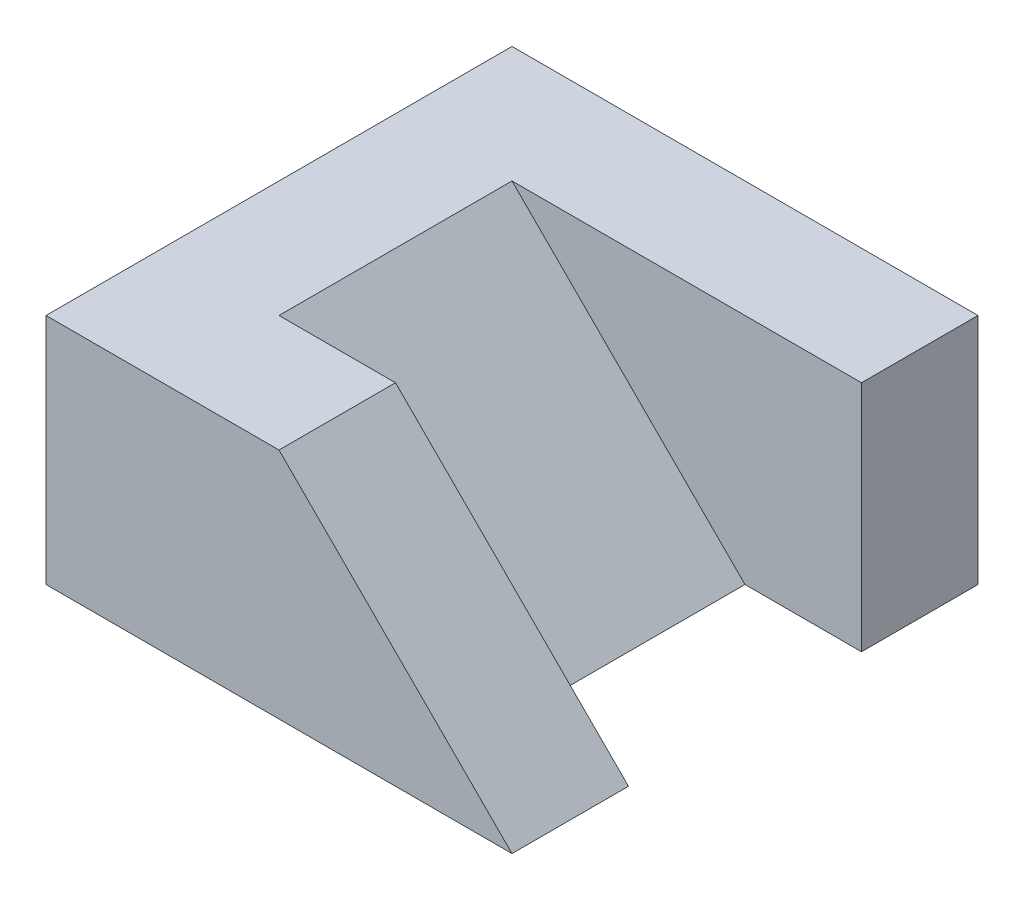
ISO-10303-21;
HEADER;
FILE_DESCRIPTION(('STEP AP214'),'2;1');
FILE_NAME('part.step','',(''),(''),'','','');
FILE_SCHEMA(('AUTOMOTIVE_DESIGN { 1 0 10303 214 1 1 1 1 }'));
ENDSEC;
DATA;
#1=APPLICATION_CONTEXT('core data for automotive mechanical design processes');
#2=APPLICATION_PROTOCOL_DEFINITION('international standard','automotive_design',2000,#1);
#3=PRODUCT_CONTEXT('',#1,'mechanical');
#4=PRODUCT('Part','Part','',(#3));
#5=PRODUCT_RELATED_PRODUCT_CATEGORY('part','',(#4));
#6=PRODUCT_DEFINITION_FORMATION('','',#4);
#7=PRODUCT_DEFINITION_CONTEXT('part definition',#1,'design');
#8=PRODUCT_DEFINITION('design','',#6,#7);
#9=PRODUCT_DEFINITION_SHAPE('','',#8);
#10=(LENGTH_UNIT() NAMED_UNIT(*) SI_UNIT(.MILLI.,.METRE.));
#11=(NAMED_UNIT(*) PLANE_ANGLE_UNIT() SI_UNIT($,.RADIAN.));
#12=(NAMED_UNIT(*) SI_UNIT($,.STERADIAN.) SOLID_ANGLE_UNIT());
#13=UNCERTAINTY_MEASURE_WITH_UNIT(LENGTH_MEASURE(1.E-05),#10,'distance_accuracy_value','');
#14=(GEOMETRIC_REPRESENTATION_CONTEXT(3) GLOBAL_UNCERTAINTY_ASSIGNED_CONTEXT((#13)) GLOBAL_UNIT_ASSIGNED_CONTEXT((#10,
#11,#12)) REPRESENTATION_CONTEXT('',''));
#15=CARTESIAN_POINT('',(0.,0.,0.));
#16=DIRECTION('',(0.,0.,1.));
#17=DIRECTION('',(1.,0.,0.));
#18=AXIS2_PLACEMENT_3D('',#15,#16,#17);
#19=CARTESIAN_POINT('',(10.,20.,30.));
#20=DIRECTION('',(0.,0.,1.));
#21=DIRECTION('',(1.,0.,0.));
#22=AXIS2_PLACEMENT_3D('',#19,#20,#21);
#23=PLANE('',#22);
#24=DIRECTION('',(-1.,0.,0.));
#25=VECTOR('',#24,1.);
#26=CARTESIAN_POINT('',(10.,20.,30.));
#27=LINE('',#26,#25);
#28=CARTESIAN_POINT('',(20.,20.,30.));
#29=VERTEX_POINT('',#28);
#30=CARTESIAN_POINT('',(10.,20.,30.));
#31=VERTEX_POINT('',#30);
#32=EDGE_CURVE('E150',#29,#31,#27,.T.);
#33=ORIENTED_EDGE('',*,*,#32,.F.);
#34=DIRECTION('',(0.707106781186548,-0.707106781186548,0.));
#35=VECTOR('',#34,1.);
#36=CARTESIAN_POINT('',(15.,25.,30.));
#37=LINE('',#36,#35);
#38=CARTESIAN_POINT('',(40.,0.,30.));
#39=VERTEX_POINT('',#38);
#40=EDGE_CURVE('E167',#29,#39,#37,.T.);
#41=ORIENTED_EDGE('',*,*,#40,.T.);
#42=DIRECTION('',(-1.,0.,0.));
#43=VECTOR('',#42,1.);
#44=CARTESIAN_POINT('',(10.,0.,30.));
#45=LINE('',#44,#43);
#46=CARTESIAN_POINT('',(30.,0.,30.));
#47=VERTEX_POINT('',#46);
#48=EDGE_CURVE('E48',#39,#47,#45,.T.);
#49=ORIENTED_EDGE('',*,*,#48,.T.);
#50=DIRECTION('',(-0.707106781186548,0.707106781186547,0.));
#51=VECTOR('',#50,1.);
#52=CARTESIAN_POINT('',(10.,20.,30.));
#53=LINE('',#52,#51);
#54=EDGE_CURVE('E161',#47,#31,#53,.T.);
#55=ORIENTED_EDGE('',*,*,#54,.T.);
#56=EDGE_LOOP('',(#33,#41,#49,#55));
#57=FACE_BOUND('',#56,.T.);
#58=ADVANCED_FACE('F33',(#57),#23,.F.);
#59=CARTESIAN_POINT('',(40.,20.,10.));
#60=DIRECTION('',(0.,0.,-1.));
#61=DIRECTION('',(-1.,0.,0.));
#62=AXIS2_PLACEMENT_3D('',#59,#60,#61);
#63=PLANE('',#62);
#64=DIRECTION('',(-0.707106781186548,0.707106781186547,0.));
#65=VECTOR('',#64,1.);
#66=CARTESIAN_POINT('',(10.,20.,10.));
#67=LINE('',#66,#65);
#68=CARTESIAN_POINT('',(30.,0.,10.));
#69=VERTEX_POINT('',#68);
#70=CARTESIAN_POINT('',(10.,20.,10.));
#71=VERTEX_POINT('',#70);
#72=EDGE_CURVE('E164',#69,#71,#67,.T.);
#73=ORIENTED_EDGE('',*,*,#72,.F.);
#74=DIRECTION('',(1.,0.,0.));
#75=VECTOR('',#74,1.);
#76=CARTESIAN_POINT('',(40.,0.,10.));
#77=LINE('',#76,#75);
#78=CARTESIAN_POINT('',(40.,0.,10.));
#79=VERTEX_POINT('',#78);
#80=EDGE_CURVE('E114',#69,#79,#77,.T.);
#81=ORIENTED_EDGE('',*,*,#80,.T.);
#82=DIRECTION('',(0.,-1.,0.));
#83=VECTOR('',#82,1.);
#84=CARTESIAN_POINT('',(40.,20.,10.));
#85=LINE('',#84,#83);
#86=CARTESIAN_POINT('',(40.,20.,10.));
#87=VERTEX_POINT('',#86);
#88=EDGE_CURVE('E41',#87,#79,#85,.T.);
#89=ORIENTED_EDGE('',*,*,#88,.F.);
#90=DIRECTION('',(1.,0.,0.));
#91=VECTOR('',#90,1.);
#92=CARTESIAN_POINT('',(40.,20.,10.));
#93=LINE('',#92,#91);
#94=EDGE_CURVE('E99',#71,#87,#93,.T.);
#95=ORIENTED_EDGE('',*,*,#94,.F.);
#96=EDGE_LOOP('',(#73,#81,#89,#95));
#97=FACE_BOUND('',#96,.T.);
#98=ADVANCED_FACE('F112',(#97),#63,.F.);
#99=CARTESIAN_POINT('',(0.,20.,40.));
#100=DIRECTION('',(1.,0.,0.));
#101=DIRECTION('',(0.,0.,-1.));
#102=AXIS2_PLACEMENT_3D('',#99,#100,#101);
#103=PLANE('',#102);
#104=DIRECTION('',(0.,0.,1.));
#105=VECTOR('',#104,1.);
#106=CARTESIAN_POINT('',(0.,0.,40.));
#107=LINE('',#106,#105);
#108=CARTESIAN_POINT('',(0.,0.,0.));
#109=VERTEX_POINT('',#108);
#110=CARTESIAN_POINT('',(0.,0.,40.));
#111=VERTEX_POINT('',#110);
#112=EDGE_CURVE('E124',#109,#111,#107,.T.);
#113=ORIENTED_EDGE('',*,*,#112,.T.);
#114=DIRECTION('',(0.,-1.,0.));
#115=VECTOR('',#114,1.);
#116=CARTESIAN_POINT('',(0.,20.,40.));
#117=LINE('',#116,#115);
#118=CARTESIAN_POINT('',(0.,20.,40.));
#119=VERTEX_POINT('',#118);
#120=EDGE_CURVE('E11',#119,#111,#117,.T.);
#121=ORIENTED_EDGE('',*,*,#120,.F.);
#122=DIRECTION('',(0.,0.,1.));
#123=VECTOR('',#122,1.);
#124=CARTESIAN_POINT('',(0.,20.,40.));
#125=LINE('',#124,#123);
#126=CARTESIAN_POINT('',(0.,20.,0.));
#127=VERTEX_POINT('',#126);
#128=EDGE_CURVE('E139',#127,#119,#125,.T.);
#129=ORIENTED_EDGE('',*,*,#128,.F.);
#130=DIRECTION('',(0.,-1.,0.));
#131=VECTOR('',#130,1.);
#132=CARTESIAN_POINT('',(0.,20.,0.));
#133=LINE('',#132,#131);
#134=EDGE_CURVE('E120',#127,#109,#133,.T.);
#135=ORIENTED_EDGE('',*,*,#134,.T.);
#136=EDGE_LOOP('',(#113,#121,#129,#135));
#137=FACE_BOUND('',#136,.T.);
#138=ADVANCED_FACE('F35',(#137),#103,.F.);
#139=CARTESIAN_POINT('',(40.,20.,40.));
#140=DIRECTION('',(0.,0.,-1.));
#141=DIRECTION('',(-1.,0.,0.));
#142=AXIS2_PLACEMENT_3D('',#139,#140,#141);
#143=PLANE('',#142);
#144=DIRECTION('',(1.,0.,0.));
#145=VECTOR('',#144,1.);
#146=CARTESIAN_POINT('',(40.,0.,40.));
#147=LINE('',#146,#145);
#148=CARTESIAN_POINT('',(40.,0.,40.));
#149=VERTEX_POINT('',#148);
#150=EDGE_CURVE('E127',#111,#149,#147,.T.);
#151=ORIENTED_EDGE('',*,*,#150,.T.);
#152=DIRECTION('',(0.707106781186548,-0.707106781186548,0.));
#153=VECTOR('',#152,1.);
#154=CARTESIAN_POINT('',(20.,20.,40.));
#155=LINE('',#154,#153);
#156=CARTESIAN_POINT('',(20.,20.,40.));
#157=VERTEX_POINT('',#156);
#158=EDGE_CURVE('E171',#157,#149,#155,.T.);
#159=ORIENTED_EDGE('',*,*,#158,.F.);
#160=DIRECTION('',(1.,0.,0.));
#161=VECTOR('',#160,1.);
#162=CARTESIAN_POINT('',(40.,20.,40.));
#163=LINE('',#162,#161);
#164=EDGE_CURVE('E89',#119,#157,#163,.T.);
#165=ORIENTED_EDGE('',*,*,#164,.F.);
#166=ORIENTED_EDGE('',*,*,#120,.T.);
#167=EDGE_LOOP('',(#151,#159,#165,#166));
#168=FACE_BOUND('',#167,.T.);
#169=ADVANCED_FACE('F177',(#168),#143,.F.);
#170=CARTESIAN_POINT('',(40.,20.,0.));
#171=DIRECTION('',(-1.,0.,0.));
#172=DIRECTION('',(0.,0.,1.));
#173=AXIS2_PLACEMENT_3D('',#170,#171,#172);
#174=PLANE('',#173);
#175=DIRECTION('',(0.,0.,-1.));
#176=VECTOR('',#175,1.);
#177=CARTESIAN_POINT('',(40.,0.,0.));
#178=LINE('',#177,#176);
#179=CARTESIAN_POINT('',(40.,0.,0.));
#180=VERTEX_POINT('',#179);
#181=EDGE_CURVE('E136',#79,#180,#178,.T.);
#182=ORIENTED_EDGE('',*,*,#181,.T.);
#183=DIRECTION('',(0.,-1.,0.));
#184=VECTOR('',#183,1.);
#185=CARTESIAN_POINT('',(40.,20.,0.));
#186=LINE('',#185,#184);
#187=CARTESIAN_POINT('',(40.,20.,0.));
#188=VERTEX_POINT('',#187);
#189=EDGE_CURVE('E117',#188,#180,#186,.T.);
#190=ORIENTED_EDGE('',*,*,#189,.F.);
#191=DIRECTION('',(0.,0.,-1.));
#192=VECTOR('',#191,1.);
#193=CARTESIAN_POINT('',(40.,20.,0.));
#194=LINE('',#193,#192);
#195=EDGE_CURVE('E103',#87,#188,#194,.T.);
#196=ORIENTED_EDGE('',*,*,#195,.F.);
#197=ORIENTED_EDGE('',*,*,#88,.T.);
#198=EDGE_LOOP('',(#182,#190,#196,#197));
#199=FACE_BOUND('',#198,.T.);
#200=ADVANCED_FACE('F118',(#199),#174,.F.);
#201=CARTESIAN_POINT('',(0.,20.,0.));
#202=DIRECTION('',(0.,0.,1.));
#203=DIRECTION('',(1.,0.,0.));
#204=AXIS2_PLACEMENT_3D('',#201,#202,#203);
#205=PLANE('',#204);
#206=DIRECTION('',(-1.,0.,0.));
#207=VECTOR('',#206,1.);
#208=CARTESIAN_POINT('',(0.,0.,0.));
#209=LINE('',#208,#207);
#210=EDGE_CURVE('E81',#180,#109,#209,.T.);
#211=ORIENTED_EDGE('',*,*,#210,.T.);
#212=ORIENTED_EDGE('',*,*,#134,.F.);
#213=DIRECTION('',(-1.,0.,0.));
#214=VECTOR('',#213,1.);
#215=CARTESIAN_POINT('',(0.,20.,0.));
#216=LINE('',#215,#214);
#217=EDGE_CURVE('E57',#188,#127,#216,.T.);
#218=ORIENTED_EDGE('',*,*,#217,.F.);
#219=ORIENTED_EDGE('',*,*,#189,.T.);
#220=EDGE_LOOP('',(#211,#212,#218,#219));
#221=FACE_BOUND('',#220,.T.);
#222=ADVANCED_FACE('F141',(#221),#205,.F.);
#223=CARTESIAN_POINT('',(0.,20.,0.));
#224=DIRECTION('',(0.,-1.,0.));
#225=DIRECTION('',(0.,0.,-1.));
#226=AXIS2_PLACEMENT_3D('',#223,#224,#225);
#227=PLANE('',#226);
#228=ORIENTED_EDGE('',*,*,#164,.T.);
#229=DIRECTION('',(0.,0.,1.));
#230=VECTOR('',#229,1.);
#231=CARTESIAN_POINT('',(20.,20.,20.));
#232=LINE('',#231,#230);
#233=EDGE_CURVE('E159',#29,#157,#232,.T.);
#234=ORIENTED_EDGE('',*,*,#233,.F.);
#235=ORIENTED_EDGE('',*,*,#32,.T.);
#236=DIRECTION('',(0.,0.,-1.));
#237=VECTOR('',#236,1.);
#238=CARTESIAN_POINT('',(10.,20.,10.));
#239=LINE('',#238,#237);
#240=EDGE_CURVE('E106',#31,#71,#239,.T.);
#241=ORIENTED_EDGE('',*,*,#240,.T.);
#242=ORIENTED_EDGE('',*,*,#94,.T.);
#243=ORIENTED_EDGE('',*,*,#195,.T.);
#244=ORIENTED_EDGE('',*,*,#217,.T.);
#245=ORIENTED_EDGE('',*,*,#128,.T.);
#246=EDGE_LOOP('',(#228,#234,#235,#241,#242,#243,#244,#245));
#247=FACE_BOUND('',#246,.T.);
#248=ADVANCED_FACE('F101',(#247),#227,.F.);
#249=CARTESIAN_POINT('',(0.,0.,0.));
#250=DIRECTION('',(0.,-1.,0.));
#251=DIRECTION('',(0.,0.,-1.));
#252=AXIS2_PLACEMENT_3D('',#249,#250,#251);
#253=PLANE('',#252);
#254=DIRECTION('',(0.,0.,-1.));
#255=VECTOR('',#254,1.);
#256=CARTESIAN_POINT('',(30.,0.,30.));
#257=LINE('',#256,#255);
#258=EDGE_CURVE('E128',#47,#69,#257,.T.);
#259=ORIENTED_EDGE('',*,*,#258,.F.);
#260=ORIENTED_EDGE('',*,*,#48,.F.);
#261=DIRECTION('',(0.,0.,-1.));
#262=VECTOR('',#261,1.);
#263=CARTESIAN_POINT('',(40.,0.,30.));
#264=LINE('',#263,#262);
#265=EDGE_CURVE('E131',#149,#39,#264,.T.);
#266=ORIENTED_EDGE('',*,*,#265,.F.);
#267=ORIENTED_EDGE('',*,*,#150,.F.);
#268=ORIENTED_EDGE('',*,*,#112,.F.);
#269=ORIENTED_EDGE('',*,*,#210,.F.);
#270=ORIENTED_EDGE('',*,*,#181,.F.);
#271=ORIENTED_EDGE('',*,*,#80,.F.);
#272=EDGE_LOOP('',(#259,#260,#266,#267,#268,#269,#270,#271));
#273=FACE_BOUND('',#272,.T.);
#274=ADVANCED_FACE('F144',(#273),#253,.T.);
#275=CARTESIAN_POINT('',(10.,20.,30.));
#276=DIRECTION('',(-0.707106781186547,-0.707106781186548,0.));
#277=DIRECTION('',(0.707106781186548,-0.707106781186547,0.));
#278=AXIS2_PLACEMENT_3D('',#275,#276,#277);
#279=PLANE('',#278);
#280=ORIENTED_EDGE('',*,*,#72,.T.);
#281=ORIENTED_EDGE('',*,*,#240,.F.);
#282=ORIENTED_EDGE('',*,*,#54,.F.);
#283=ORIENTED_EDGE('',*,*,#258,.T.);
#284=EDGE_LOOP('',(#280,#281,#282,#283));
#285=FACE_BOUND('',#284,.T.);
#286=ADVANCED_FACE('F166',(#285),#279,.F.);
#287=CARTESIAN_POINT('',(20.,20.,20.));
#288=DIRECTION('',(-0.707106781186548,-0.707106781186548,0.));
#289=DIRECTION('',(0.707106781186548,-0.707106781186548,0.));
#290=AXIS2_PLACEMENT_3D('',#287,#288,#289);
#291=PLANE('',#290);
#292=ORIENTED_EDGE('',*,*,#233,.T.);
#293=ORIENTED_EDGE('',*,*,#158,.T.);
#294=ORIENTED_EDGE('',*,*,#265,.T.);
#295=ORIENTED_EDGE('',*,*,#40,.F.);
#296=EDGE_LOOP('',(#292,#293,#294,#295));
#297=FACE_BOUND('',#296,.T.);
#298=ADVANCED_FACE('F173',(#297),#291,.F.);
#299=CLOSED_SHELL('',(#58,#98,#138,#169,#200,#222,#248,#274,#286,#298));
#300=MANIFOLD_SOLID_BREP('B2',#299);
#301=ADVANCED_BREP_SHAPE_REPRESENTATION('',(#18,#300),#14);
#302=SHAPE_DEFINITION_REPRESENTATION(#9,#301);
ENDSEC;
END-ISO-10303-21;
